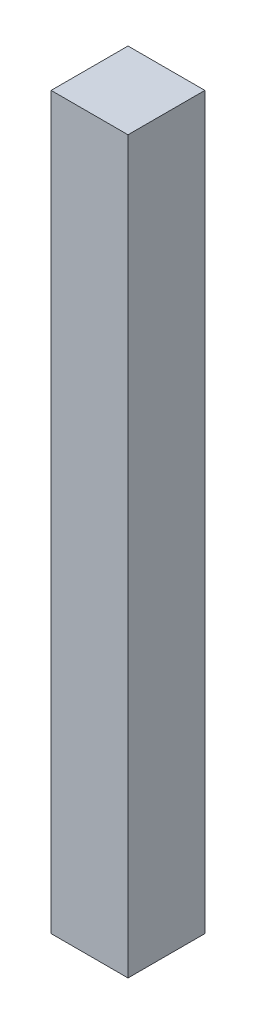
ISO-10303-21;
HEADER;
FILE_DESCRIPTION(('STEP AP214'),'2;1');
FILE_NAME('part.step','',(''),(''),'','','');
FILE_SCHEMA(('AUTOMOTIVE_DESIGN { 1 0 10303 214 1 1 1 1 }'));
ENDSEC;
DATA;
#1=APPLICATION_CONTEXT('core data for automotive mechanical design processes');
#2=APPLICATION_PROTOCOL_DEFINITION('international standard','automotive_design',2000,#1);
#3=PRODUCT_CONTEXT('',#1,'mechanical');
#4=PRODUCT('Part','Part','',(#3));
#5=PRODUCT_RELATED_PRODUCT_CATEGORY('part','',(#4));
#6=PRODUCT_DEFINITION_FORMATION('','',#4);
#7=PRODUCT_DEFINITION_CONTEXT('part definition',#1,'design');
#8=PRODUCT_DEFINITION('design','',#6,#7);
#9=PRODUCT_DEFINITION_SHAPE('','',#8);
#10=(LENGTH_UNIT() NAMED_UNIT(*) SI_UNIT(.MILLI.,.METRE.));
#11=(NAMED_UNIT(*) PLANE_ANGLE_UNIT() SI_UNIT($,.RADIAN.));
#12=(NAMED_UNIT(*) SI_UNIT($,.STERADIAN.) SOLID_ANGLE_UNIT());
#13=UNCERTAINTY_MEASURE_WITH_UNIT(LENGTH_MEASURE(1.E-05),#10,'distance_accuracy_value','');
#14=(GEOMETRIC_REPRESENTATION_CONTEXT(3) GLOBAL_UNCERTAINTY_ASSIGNED_CONTEXT((#13)) GLOBAL_UNIT_ASSIGNED_CONTEXT((#10,
#11,#12)) REPRESENTATION_CONTEXT('',''));
#15=CARTESIAN_POINT('',(0.,0.,0.));
#16=DIRECTION('',(0.,0.,1.));
#17=DIRECTION('',(1.,0.,0.));
#18=AXIS2_PLACEMENT_3D('',#15,#16,#17);
#19=CARTESIAN_POINT('',(10.,95.,-10.));
#20=DIRECTION('',(-1.,0.,0.));
#21=DIRECTION('',(0.,0.,1.));
#22=AXIS2_PLACEMENT_3D('',#19,#20,#21);
#23=PLANE('',#22);
#24=DIRECTION('',(0.,0.,-1.));
#25=VECTOR('',#24,1.);
#26=CARTESIAN_POINT('',(10.,-95.,-10.));
#27=LINE('',#26,#25);
#28=CARTESIAN_POINT('',(10.,-95.,10.));
#29=VERTEX_POINT('',#28);
#30=CARTESIAN_POINT('',(10.,-95.,-10.));
#31=VERTEX_POINT('',#30);
#32=EDGE_CURVE('E104',#29,#31,#27,.T.);
#33=ORIENTED_EDGE('',*,*,#32,.T.);
#34=DIRECTION('',(0.,-1.,0.));
#35=VECTOR('',#34,1.);
#36=CARTESIAN_POINT('',(10.,95.,-10.));
#37=LINE('',#36,#35);
#38=CARTESIAN_POINT('',(10.,95.,-10.));
#39=VERTEX_POINT('',#38);
#40=EDGE_CURVE('E11',#39,#31,#37,.T.);
#41=ORIENTED_EDGE('',*,*,#40,.F.);
#42=DIRECTION('',(0.,0.,-1.));
#43=VECTOR('',#42,1.);
#44=CARTESIAN_POINT('',(10.,95.,-10.));
#45=LINE('',#44,#43);
#46=CARTESIAN_POINT('',(10.,95.,10.));
#47=VERTEX_POINT('',#46);
#48=EDGE_CURVE('E92',#47,#39,#45,.T.);
#49=ORIENTED_EDGE('',*,*,#48,.F.);
#50=DIRECTION('',(0.,-1.,0.));
#51=VECTOR('',#50,1.);
#52=CARTESIAN_POINT('',(10.,95.,10.));
#53=LINE('',#52,#51);
#54=EDGE_CURVE('E100',#47,#29,#53,.T.);
#55=ORIENTED_EDGE('',*,*,#54,.T.);
#56=EDGE_LOOP('',(#33,#41,#49,#55));
#57=FACE_BOUND('',#56,.T.);
#58=ADVANCED_FACE('F41',(#57),#23,.F.);
#59=CARTESIAN_POINT('',(-10.,95.,-10.));
#60=DIRECTION('',(0.,0.,1.));
#61=DIRECTION('',(1.,0.,0.));
#62=AXIS2_PLACEMENT_3D('',#59,#60,#61);
#63=PLANE('',#62);
#64=DIRECTION('',(-1.,0.,0.));
#65=VECTOR('',#64,1.);
#66=CARTESIAN_POINT('',(-10.,-95.,-10.));
#67=LINE('',#66,#65);
#68=CARTESIAN_POINT('',(-10.,-95.,-10.));
#69=VERTEX_POINT('',#68);
#70=EDGE_CURVE('E96',#31,#69,#67,.T.);
#71=ORIENTED_EDGE('',*,*,#70,.T.);
#72=DIRECTION('',(0.,-1.,0.));
#73=VECTOR('',#72,1.);
#74=CARTESIAN_POINT('',(-10.,95.,-10.));
#75=LINE('',#74,#73);
#76=CARTESIAN_POINT('',(-10.,95.,-10.));
#77=VERTEX_POINT('',#76);
#78=EDGE_CURVE('E49',#77,#69,#75,.T.);
#79=ORIENTED_EDGE('',*,*,#78,.F.);
#80=DIRECTION('',(-1.,0.,0.));
#81=VECTOR('',#80,1.);
#82=CARTESIAN_POINT('',(-10.,95.,-10.));
#83=LINE('',#82,#81);
#84=EDGE_CURVE('E87',#39,#77,#83,.T.);
#85=ORIENTED_EDGE('',*,*,#84,.F.);
#86=ORIENTED_EDGE('',*,*,#40,.T.);
#87=EDGE_LOOP('',(#71,#79,#85,#86));
#88=FACE_BOUND('',#87,.T.);
#89=ADVANCED_FACE('F95',(#88),#63,.F.);
#90=CARTESIAN_POINT('',(-10.,95.,-10.));
#91=DIRECTION('',(1.,0.,0.));
#92=DIRECTION('',(0.,0.,-1.));
#93=AXIS2_PLACEMENT_3D('',#90,#91,#92);
#94=PLANE('',#93);
#95=DIRECTION('',(0.,0.,1.));
#96=VECTOR('',#95,1.);
#97=CARTESIAN_POINT('',(-10.,-95.,-10.));
#98=LINE('',#97,#96);
#99=CARTESIAN_POINT('',(-10.,-95.,10.));
#100=VERTEX_POINT('',#99);
#101=EDGE_CURVE('E74',#69,#100,#98,.T.);
#102=ORIENTED_EDGE('',*,*,#101,.T.);
#103=DIRECTION('',(0.,-1.,0.));
#104=VECTOR('',#103,1.);
#105=CARTESIAN_POINT('',(-10.,95.,10.));
#106=LINE('',#105,#104);
#107=CARTESIAN_POINT('',(-10.,95.,10.));
#108=VERTEX_POINT('',#107);
#109=EDGE_CURVE('E97',#108,#100,#106,.T.);
#110=ORIENTED_EDGE('',*,*,#109,.F.);
#111=DIRECTION('',(0.,0.,1.));
#112=VECTOR('',#111,1.);
#113=CARTESIAN_POINT('',(-10.,95.,-10.));
#114=LINE('',#113,#112);
#115=EDGE_CURVE('E90',#77,#108,#114,.T.);
#116=ORIENTED_EDGE('',*,*,#115,.F.);
#117=ORIENTED_EDGE('',*,*,#78,.T.);
#118=EDGE_LOOP('',(#102,#110,#116,#117));
#119=FACE_BOUND('',#118,.T.);
#120=ADVANCED_FACE('F98',(#119),#94,.F.);
#121=CARTESIAN_POINT('',(-10.,95.,10.));
#122=DIRECTION('',(0.,0.,-1.));
#123=DIRECTION('',(-1.,0.,0.));
#124=AXIS2_PLACEMENT_3D('',#121,#122,#123);
#125=PLANE('',#124);
#126=DIRECTION('',(1.,0.,0.));
#127=VECTOR('',#126,1.);
#128=CARTESIAN_POINT('',(-10.,-95.,10.));
#129=LINE('',#128,#127);
#130=EDGE_CURVE('E80',#100,#29,#129,.T.);
#131=ORIENTED_EDGE('',*,*,#130,.T.);
#132=ORIENTED_EDGE('',*,*,#54,.F.);
#133=DIRECTION('',(1.,0.,0.));
#134=VECTOR('',#133,1.);
#135=CARTESIAN_POINT('',(-10.,95.,10.));
#136=LINE('',#135,#134);
#137=EDGE_CURVE('E57',#108,#47,#136,.T.);
#138=ORIENTED_EDGE('',*,*,#137,.F.);
#139=ORIENTED_EDGE('',*,*,#109,.T.);
#140=EDGE_LOOP('',(#131,#132,#138,#139));
#141=FACE_BOUND('',#140,.T.);
#142=ADVANCED_FACE('F111',(#141),#125,.F.);
#143=CARTESIAN_POINT('',(0.,95.,0.));
#144=DIRECTION('',(0.,1.,0.));
#145=DIRECTION('',(0.,0.,1.));
#146=AXIS2_PLACEMENT_3D('',#143,#144,#145);
#147=PLANE('',#146);
#148=ORIENTED_EDGE('',*,*,#48,.T.);
#149=ORIENTED_EDGE('',*,*,#84,.T.);
#150=ORIENTED_EDGE('',*,*,#115,.T.);
#151=ORIENTED_EDGE('',*,*,#137,.T.);
#152=EDGE_LOOP('',(#148,#149,#150,#151));
#153=FACE_BOUND('',#152,.T.);
#154=ADVANCED_FACE('F88',(#153),#147,.T.);
#155=CARTESIAN_POINT('',(0.,-95.,0.));
#156=DIRECTION('',(0.,1.,0.));
#157=DIRECTION('',(0.,0.,1.));
#158=AXIS2_PLACEMENT_3D('',#155,#156,#157);
#159=PLANE('',#158);
#160=ORIENTED_EDGE('',*,*,#32,.F.);
#161=ORIENTED_EDGE('',*,*,#130,.F.);
#162=ORIENTED_EDGE('',*,*,#101,.F.);
#163=ORIENTED_EDGE('',*,*,#70,.F.);
#164=EDGE_LOOP('',(#160,#161,#162,#163));
#165=FACE_BOUND('',#164,.T.);
#166=ADVANCED_FACE('F114',(#165),#159,.F.);
#167=CLOSED_SHELL('',(#58,#89,#120,#142,#154,#166));
#168=MANIFOLD_SOLID_BREP('B2',#167);
#169=ADVANCED_BREP_SHAPE_REPRESENTATION('',(#18,#168),#14);
#170=SHAPE_DEFINITION_REPRESENTATION(#9,#169);
ENDSEC;
END-ISO-10303-21;
